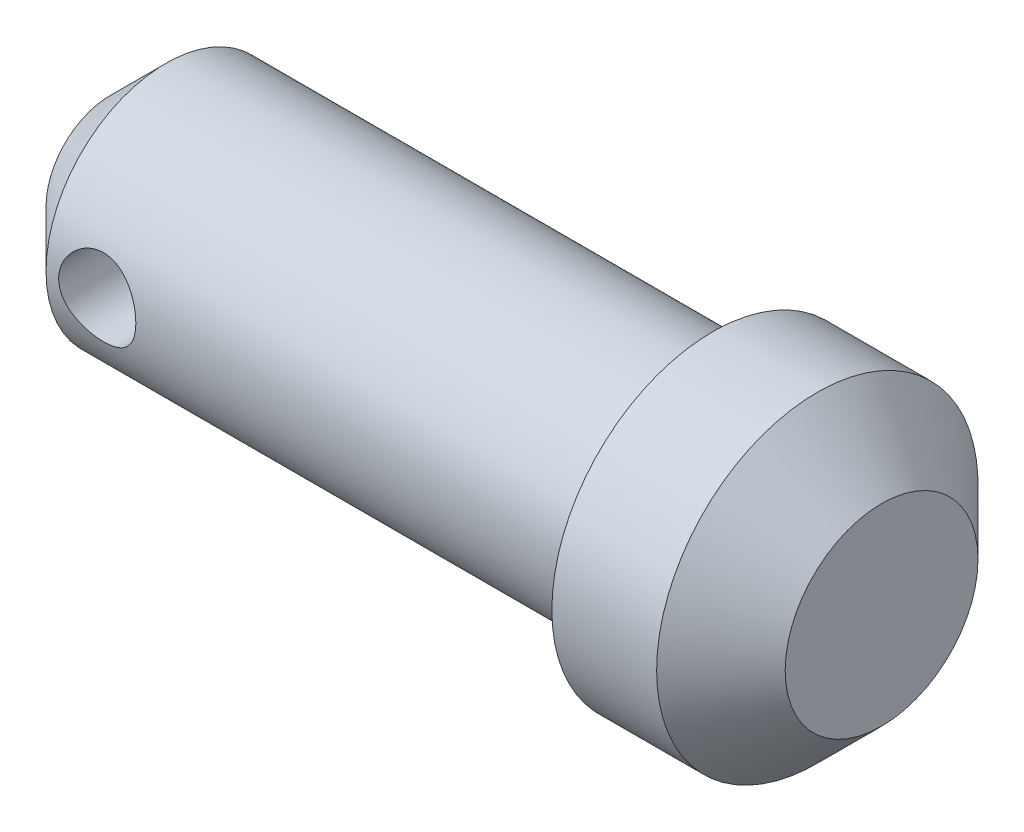
ISO-10303-21;
HEADER;
FILE_DESCRIPTION(('STEP AP214'),'2;1');
FILE_NAME('part.step','',(''),(''),'','','');
FILE_SCHEMA(('AUTOMOTIVE_DESIGN { 1 0 10303 214 1 1 1 1 }'));
ENDSEC;
DATA;
#1=APPLICATION_CONTEXT('core data for automotive mechanical design processes');
#2=APPLICATION_PROTOCOL_DEFINITION('international standard','automotive_design',2000,#1);
#3=PRODUCT_CONTEXT('',#1,'mechanical');
#4=PRODUCT('Part','Part','',(#3));
#5=PRODUCT_RELATED_PRODUCT_CATEGORY('part','',(#4));
#6=PRODUCT_DEFINITION_FORMATION('','',#4);
#7=PRODUCT_DEFINITION_CONTEXT('part definition',#1,'design');
#8=PRODUCT_DEFINITION('design','',#6,#7);
#9=PRODUCT_DEFINITION_SHAPE('','',#8);
#10=(LENGTH_UNIT() NAMED_UNIT(*) SI_UNIT(.MILLI.,.METRE.));
#11=(NAMED_UNIT(*) PLANE_ANGLE_UNIT() SI_UNIT($,.RADIAN.));
#12=(NAMED_UNIT(*) SI_UNIT($,.STERADIAN.) SOLID_ANGLE_UNIT());
#13=UNCERTAINTY_MEASURE_WITH_UNIT(LENGTH_MEASURE(1.E-05),#10,'distance_accuracy_value','');
#14=(GEOMETRIC_REPRESENTATION_CONTEXT(3) GLOBAL_UNCERTAINTY_ASSIGNED_CONTEXT((#13)) GLOBAL_UNIT_ASSIGNED_CONTEXT((#10,
#11,#12)) REPRESENTATION_CONTEXT('',''));
#15=CARTESIAN_POINT('',(0.,0.,0.));
#16=DIRECTION('',(0.,0.,1.));
#17=DIRECTION('',(1.,0.,0.));
#18=AXIS2_PLACEMENT_3D('',#15,#16,#17);
#19=CARTESIAN_POINT('',(0.,0.,0.));
#20=DIRECTION('',(-1.,0.,0.));
#21=DIRECTION('',(0.,0.,1.));
#22=AXIS2_PLACEMENT_3D('',#19,#20,#21);
#23=PLANE('',#22);
#24=CARTESIAN_POINT('',(0.,0.,0.));
#25=DIRECTION('',(-1.,0.,0.));
#26=DIRECTION('',(0.,0.,1.));
#27=AXIS2_PLACEMENT_3D('',#24,#25,#26);
#28=CIRCLE('',#27,10.);
#29=CARTESIAN_POINT('',(0.,0.,10.));
#30=VERTEX_POINT('',#29);
#31=EDGE_CURVE('E10',#30,#30,#28,.T.);
#32=ORIENTED_EDGE('',*,*,#31,.T.);
#33=EDGE_LOOP('',(#32));
#34=FACE_BOUND('',#33,.T.);
#35=ADVANCED_FACE('F37',(#34),#23,.T.);
#36=CARTESIAN_POINT('',(0.,0.,0.));
#37=DIRECTION('',(1.,0.,0.));
#38=DIRECTION('',(0.,0.,-1.));
#39=AXIS2_PLACEMENT_3D('',#36,#37,#38);
#40=CONICAL_SURFACE('',#39,10.,0.785398163397449);
#41=CARTESIAN_POINT('',(8.69999999999859,0.,0.));
#42=DIRECTION('',(-1.,0.,0.));
#43=DIRECTION('',(0.,0.,1.));
#44=AXIS2_PLACEMENT_3D('',#41,#42,#43);
#45=CIRCLE('',#44,18.6999999999986);
#46=CARTESIAN_POINT('',(8.69999999999859,0.,18.6999999999986));
#47=VERTEX_POINT('',#46);
#48=EDGE_CURVE('E50',#47,#47,#45,.T.);
#49=ORIENTED_EDGE('',*,*,#48,.T.);
#50=EDGE_LOOP('',(#49));
#51=FACE_BOUND('',#50,.T.);
#52=ORIENTED_EDGE('',*,*,#31,.F.);
#53=EDGE_LOOP('',(#52));
#54=FACE_BOUND('',#53,.T.);
#55=ADVANCED_FACE('F91',(#51,#54),#40,.T.);
#56=CARTESIAN_POINT('',(0.,0.,0.));
#57=DIRECTION('',(-1.,0.,0.));
#58=DIRECTION('',(0.,0.,1.));
#59=AXIS2_PLACEMENT_3D('',#56,#57,#58);
#60=CYLINDRICAL_SURFACE('',#59,18.6999999999986);
#61=CARTESIAN_POINT('',(22.6693615722956,0.,18.6999999999986));
#62=CARTESIAN_POINT('',(22.6693735509664,0.328109534118284,18.7000048554288));
#63=CARTESIAN_POINT('',(22.6423724883779,0.656146611009068,18.6912882232569));
#64=CARTESIAN_POINT('',(22.5354008768268,1.3026514538392,18.6573812329447));
#65=CARTESIAN_POINT('',(22.4554209237638,1.62111751036627,18.6321879501011));
#66=CARTESIAN_POINT('',(22.245508831408,2.238968089823,18.5680773563979));
#67=CARTESIAN_POINT('',(22.1156564700291,2.53838220188377,18.5291819721548));
#68=CARTESIAN_POINT('',(21.8098989363146,3.11130651797304,18.4416310751336));
#69=CARTESIAN_POINT('',(21.6339857638815,3.38481221083469,18.3929738672114));
#70=CARTESIAN_POINT('',(21.3365508082946,3.77428013280126,18.3156533449803));
#71=CARTESIAN_POINT('',(21.2300157778527,3.90232724347732,18.2887354355524));
#72=CARTESIAN_POINT('',(21.0067535096186,4.14905616968068,18.2343425448417));
#73=CARTESIAN_POINT('',(20.890029677546,4.26774108956259,18.2068677520432));
#74=CARTESIAN_POINT('',(20.6470455986028,4.4950793667383,18.1520785703311));
#75=CARTESIAN_POINT('',(20.5207801226247,4.6037271498269,18.1247642783437));
#76=CARTESIAN_POINT('',(20.2595791511604,4.81020145237185,18.0710634960799));
#77=CARTESIAN_POINT('',(20.1246468381258,4.90803190842979,18.0446766706836));
#78=CARTESIAN_POINT('',(19.8431698302541,5.09472465659219,17.9928713578608));
#79=CARTESIAN_POINT('',(19.6964110211033,5.18327693138028,17.9674976741915));
#80=CARTESIAN_POINT('',(19.3955908380135,5.34761970843705,17.9192716978587));
#81=CARTESIAN_POINT('',(19.2415323710221,5.42341523699652,17.8964184133608));
#82=CARTESIAN_POINT('',(18.9270749427392,5.56167551879581,17.8539351665503));
#83=CARTESIAN_POINT('',(18.7666747565416,5.62413768163344,17.8343058307558));
#84=CARTESIAN_POINT('',(18.4407818920026,5.73512730708185,17.7989244314423));
#85=CARTESIAN_POINT('',(18.2752915348944,5.783661020055,17.7831706292405));
#86=CARTESIAN_POINT('',(17.945622610596,5.8650729815511,17.7564832509881));
#87=CARTESIAN_POINT('',(17.7815637245673,5.89839175445874,17.7454148263501));
#88=CARTESIAN_POINT('',(17.4510626526247,5.95121290359013,17.7277703908305));
#89=CARTESIAN_POINT('',(17.2846214764323,5.97072096626196,17.721192531035));
#90=CARTESIAN_POINT('',(16.9505791194139,5.99574585479344,17.7127413716562));
#91=CARTESIAN_POINT('',(16.7829779950792,6.00126335727513,17.7108678445584));
#92=CARTESIAN_POINT('',(16.4479188395278,5.99825219490308,17.7118879279125));
#93=CARTESIAN_POINT('',(16.2804608047629,5.98972388909304,17.7147814165083));
#94=CARTESIAN_POINT('',(15.9540315823558,5.95936494721762,17.7250165074377));
#95=CARTESIAN_POINT('',(15.7950003386963,5.9381105413663,17.7321653521666));
#96=CARTESIAN_POINT('',(15.4793243491549,5.88298327496223,17.7505310080279));
#97=CARTESIAN_POINT('',(15.3226804278704,5.84910615284747,17.7617491929787));
#98=CARTESIAN_POINT('',(15.0129417562595,5.76904277985811,17.7879148754638));
#99=CARTESIAN_POINT('',(14.8598460055259,5.72286004559839,17.802861307487));
#100=CARTESIAN_POINT('',(14.5580901670587,5.61854328577134,17.836058015027));
#101=CARTESIAN_POINT('',(14.4094317846026,5.56040473161652,17.8543095421234));
#102=CARTESIAN_POINT('',(14.1153598784949,5.43168648371439,17.8938922534336));
#103=CARTESIAN_POINT('',(13.9700271533132,5.36093509810377,17.915265089266));
#104=CARTESIAN_POINT('',(13.6857639149534,5.20808959767419,17.9602936796372));
#105=CARTESIAN_POINT('',(13.5468356140104,5.12599160205067,17.9839502144158));
#106=CARTESIAN_POINT('',(13.2762329184513,4.95102407600004,18.0329035493091));
#107=CARTESIAN_POINT('',(13.1445589206831,4.85815395714362,18.0582004389952));
#108=CARTESIAN_POINT('',(12.8892183851991,4.66223292016633,18.1097720464532));
#109=CARTESIAN_POINT('',(12.7655521091061,4.55918166969211,18.136046796129));
#110=CARTESIAN_POINT('',(12.5211555446983,4.33829588642842,18.1901823170992));
#111=CARTESIAN_POINT('',(12.4008565378056,4.21998741312795,18.2180583347834));
#112=CARTESIAN_POINT('',(12.1706368916388,3.97364933279474,18.2733696570101));
#113=CARTESIAN_POINT('',(12.0607129625427,3.84562283063084,18.3008050989487));
#114=CARTESIAN_POINT('',(11.8518786656944,3.58055011655919,18.3545076860038));
#115=CARTESIAN_POINT('',(11.7529734085658,3.44349976575655,18.3807742856299));
#116=CARTESIAN_POINT('',(11.566969780671,3.1613505891794,18.431396959695));
#117=CARTESIAN_POINT('',(11.479866754211,3.01625496908593,18.4557537858865));
#118=CARTESIAN_POINT('',(11.317346237551,2.7175540629313,18.5021064843882));
#119=CARTESIAN_POINT('',(11.2420417290649,2.56388360654837,18.5240789753946));
#120=CARTESIAN_POINT('',(11.1047296444641,2.25036568780717,18.5647738477796));
#121=CARTESIAN_POINT('',(11.0427168672853,2.09052067056216,18.5834974998829));
#122=CARTESIAN_POINT('',(10.9325063242742,1.76575587813771,18.6171628600495));
#123=CARTESIAN_POINT('',(10.8843077456836,1.60083640214647,18.6321047906044));
#124=CARTESIAN_POINT('',(10.8021799914685,1.26716115885481,18.6577676949712));
#125=CARTESIAN_POINT('',(10.7682502121137,1.09840555418413,18.6684888473681));
#126=CARTESIAN_POINT('',(10.7160800227462,0.765305154565457,18.6850468627906));
#127=CARTESIAN_POINT('',(10.6972572915472,0.601060358689682,18.691064747042));
#128=CARTESIAN_POINT('',(10.6732251958003,0.271416329988868,18.6987571892623));
#129=CARTESIAN_POINT('',(10.6680205226336,0.106016719003151,18.7004302504509));
#130=CARTESIAN_POINT('',(10.6712880319728,-0.224547322379835,18.6993819215603));
#131=CARTESIAN_POINT('',(10.6797531932285,-0.389711829927278,18.6966627874485));
#132=CARTESIAN_POINT('',(10.7102715514233,-0.718713427178651,18.6869083829553));
#133=CARTESIAN_POINT('',(10.7323297617664,-0.882550004515454,18.6798715201084));
#134=CARTESIAN_POINT('',(10.7890558589953,-1.20324802069183,18.661920957705));
#135=CARTESIAN_POINT('',(10.8233688235768,-1.36017856885655,18.6511165631168));
#136=CARTESIAN_POINT('',(10.9043862299088,-1.67056721241264,18.6258814385084));
#137=CARTESIAN_POINT('',(10.9510950743522,-1.82402405297531,18.6114494201473));
#138=CARTESIAN_POINT('',(11.0565007198262,-2.12636238014194,18.5793350168858));
#139=CARTESIAN_POINT('',(11.1151942900416,-2.27524508741222,18.5616535081038));
#140=CARTESIAN_POINT('',(11.2441459063846,-2.56760015912167,18.5234762600866));
#141=CARTESIAN_POINT('',(11.3144080962346,-2.71107056223199,18.5029795129091));
#142=CARTESIAN_POINT('',(11.4678694775938,-2.99519553483939,18.4591435302785));
#143=CARTESIAN_POINT('',(11.5513479753659,-3.13569025659637,18.4357460826112));
#144=CARTESIAN_POINT('',(11.7293179315259,-3.40919206498344,18.3871342419641));
#145=CARTESIAN_POINT('',(11.8238097911262,-3.54219887857011,18.3619197828041));
#146=CARTESIAN_POINT('',(12.0232206620307,-3.79999220148298,18.3103071764804));
#147=CARTESIAN_POINT('',(12.1281438291885,-3.92477540131672,18.2839085598632));
#148=CARTESIAN_POINT('',(12.3476963082257,-4.16529906081116,18.2306186203854));
#149=CARTESIAN_POINT('',(12.462322624453,-4.28104229031701,18.203727451585));
#150=CARTESIAN_POINT('',(12.7056771842277,-4.50754846720009,18.1489986633681));
#151=CARTESIAN_POINT('',(12.834796991751,-4.61789313948128,18.1211691711632));
#152=CARTESIAN_POINT('',(13.1020081539205,-4.82729663841623,18.0665136789369));
#153=CARTESIAN_POINT('',(13.2400963112562,-4.92635945286448,18.0396873266021));
#154=CARTESIAN_POINT('',(13.5244744273928,-5.11259069878339,17.9877949594023));
#155=CARTESIAN_POINT('',(13.6707677463607,-5.19975420634253,17.9627296753338));
#156=CARTESIAN_POINT('',(13.9704964842813,-5.36144657434192,17.9151331103811));
#157=CARTESIAN_POINT('',(14.1239289005396,-5.43598068654382,17.8926007775221));
#158=CARTESIAN_POINT('',(14.4365230657313,-5.57165869622423,17.8508164518812));
#159=CARTESIAN_POINT('',(14.5956676200228,-5.63283940269786,17.8315554749341));
#160=CARTESIAN_POINT('',(14.9189027764371,-5.74151138164682,17.7968621749878));
#161=CARTESIAN_POINT('',(15.0829913380578,-5.78900821853937,17.7814282960917));
#162=CARTESIAN_POINT('',(15.4149342830085,-5.8698883600862,17.7548929902745));
#163=CARTESIAN_POINT('',(15.5827881476034,-5.90327359643249,17.7437909703951));
#164=CARTESIAN_POINT('',(15.9209729416108,-5.95560131882196,17.7262962263835));
#165=CARTESIAN_POINT('',(16.0913037579908,-5.97454446181705,17.7199032880419));
#166=CARTESIAN_POINT('',(16.4248854961256,-5.99723506055895,17.7122360172627));
#167=CARTESIAN_POINT('',(16.5880849590833,-6.00166660324887,17.7107312804444));
#168=CARTESIAN_POINT('',(16.9143391143923,-5.99721676179377,17.7122386402008));
#169=CARTESIAN_POINT('',(17.0773937384889,-5.98833084206198,17.7152522756176));
#170=CARTESIAN_POINT('',(17.4020241247518,-5.95733010920259,17.725701216618));
#171=CARTESIAN_POINT('',(17.5636004902292,-5.93522096191529,17.7331346284239));
#172=CARTESIAN_POINT('',(17.8842381795106,-5.87797639128052,17.7521914698313));
#173=CARTESIAN_POINT('',(18.0432985359782,-5.84283607891416,17.7638164719838));
#174=CARTESIAN_POINT('',(18.3551005687539,-5.76054232297797,17.7906714350161));
#175=CARTESIAN_POINT('',(18.5079034191296,-5.71359946251839,17.8058379014656));
#176=CARTESIAN_POINT('',(18.8090127085453,-5.60779535409026,17.8394425632556));
#177=CARTESIAN_POINT('',(18.9573175196749,-5.54892984893895,17.857881926948));
#178=CARTESIAN_POINT('',(19.2484354741734,-5.41975377528737,17.8975089899815));
#179=CARTESIAN_POINT('',(19.3912497060574,-5.34944548994999,17.9186961408892));
#180=CARTESIAN_POINT('',(19.6706321478571,-5.19785058046816,17.963256782633));
#181=CARTESIAN_POINT('',(19.8071979599453,-5.1165597883177,17.9866311024881));
#182=CARTESIAN_POINT('',(20.0786722988687,-4.94002535193613,18.0359327628247));
#183=CARTESIAN_POINT('',(20.2132887221665,-4.84434938683073,18.0619252116352));
#184=CARTESIAN_POINT('',(20.4740747501807,-4.64235106043807,18.1148976816546));
#185=CARTESIAN_POINT('',(20.6002411809582,-4.53602473573147,18.1418780681268));
#186=CARTESIAN_POINT('',(20.9649385570244,-4.20195433710695,18.223223448193));
#187=CARTESIAN_POINT('',(21.189876329578,-3.95898282810353,18.2780322903854));
#188=CARTESIAN_POINT('',(21.4987162479157,-3.56464456251411,18.3576215597846));
#189=CARTESIAN_POINT('',(21.5983492211628,-3.42555342554392,18.3841453121101));
#190=CARTESIAN_POINT('',(21.7855197490987,-3.1391282419148,18.4352103944782));
#191=CARTESIAN_POINT('',(21.8730626433868,-2.99179787477571,18.4597525976725));
#192=CARTESIAN_POINT('',(22.0353622739844,-2.68987480456371,18.5061586667599));
#193=CARTESIAN_POINT('',(22.1101196775168,-2.53528248099983,18.5280226724003));
#194=CARTESIAN_POINT('',(22.2462402109228,-2.21989160425773,18.5684504674997));
#195=CARTESIAN_POINT('',(22.3076039655992,-2.05909334099351,18.5870144108962));
#196=CARTESIAN_POINT('',(22.4126239687353,-1.74373345175721,18.6191495900889));
#197=CARTESIAN_POINT('',(22.4572103812694,-1.58950792071379,18.632977071051));
#198=CARTESIAN_POINT('',(22.5339421120807,-1.27770157607177,18.656956017467));
#199=CARTESIAN_POINT('',(22.5660837697311,-1.12011978958868,18.6671064012457));
#200=CARTESIAN_POINT('',(22.6433188755913,-0.644104010052157,18.6915898606381));
#201=CARTESIAN_POINT('',(22.6693498160479,-0.322017109326415,18.6999952347253));
#202=CARTESIAN_POINT('',(22.6693615722956,0.,18.6999999999986));
#203=B_SPLINE_CURVE_WITH_KNOTS('',3,(#61,#62,#63,#64,#65,#66,#67,#68,#69,#70,#71,#72,#73,#74,
#75,#76,#77,#78,#79,#80,#81,#82,#83,#84,#85,#86,#87,#88,#89,#90,#91,#92,#93,#94,#95,#96,#97,#98,
#99,#100,#101,#102,#103,#104,#105,#106,#107,#108,#109,#110,#111,#112,#113,#114,#115,#116,#117,
#118,#119,#120,#121,#122,#123,#124,#125,#126,#127,#128,#129,#130,#131,#132,#133,#134,#135,#136,
#137,#138,#139,#140,#141,#142,#143,#144,#145,#146,#147,#148,#149,#150,#151,#152,#153,#154,#155,
#156,#157,#158,#159,#160,#161,#162,#163,#164,#165,#166,#167,#168,#169,#170,#171,#172,#173,#174,
#175,#176,#177,#178,#179,#180,#181,#182,#183,#184,#185,#186,#187,#188,#189,#190,#191,#192,#193,
#194,#195,#196,#197,#198,#199,#200,#201,#202),.UNSPECIFIED.,.T.,.F.,(4,2,2,2,2,2,2,2,2,2,2,2,2,
2,2,2,2,2,2,2,2,2,2,2,2,2,2,2,2,2,2,2,2,2,2,2,2,2,2,2,2,2,2,2,2,2,2,2,2,2,2,2,2,2,2,2,2,2,2,2,2,
2,2,2,2,2,2,2,2,2,4),(0.,0.983005763343034,1.96618606342749,2.94780013535518,3.92958481269156,
4.43531035245975,4.94086749050855,5.44670372688413,5.95235527111154,6.4715370928268,
6.99051387016065,7.50959138256172,8.02843559448904,8.53111986205094,9.03359703287031,
9.53604990204526,10.0384899275488,10.5197382952358,11.0011492848757,11.4824228474029,
11.9638790420874,12.452474158943,12.9412368021592,13.4300261567142,13.9188314726081,
14.4312780390876,14.9435615646747,15.4560817143466,15.9683990949599,16.4853565656101,
17.0021113796304,17.5188357841407,18.0355383232181,18.5312123402069,19.0270570929809,
19.5226472455314,20.018420291699,20.5008656508861,20.9834825919268,21.4659696015456,
21.9486298089263,22.443346028389,22.9380802758004,23.4330124222385,23.9277923217541,
24.4435185204823,24.9590618561144,25.4748178801644,25.9903589049572,26.5044603592543,
27.018352462989,27.532174198873,28.0459725602842,28.5351723875982,29.0245388617152,
29.5136958039386,30.0030364535314,30.4841990458773,30.9655337493473,31.4467725302142,
31.9281944632869,32.4291511005994,32.9302948611988,33.9318339880062,34.4507647304866,
34.9694655485423,35.4881392894436,36.0067888294656,36.4896235307943,36.9726001503313,
37.9373532021241),.UNSPECIFIED.);
#204=CARTESIAN_POINT('',(22.6693615722956,0.,18.6999999999986));
#205=VERTEX_POINT('',#204);
#206=EDGE_CURVE('E40',#205,#205,#203,.T.);
#207=ORIENTED_EDGE('',*,*,#206,.F.);
#208=EDGE_LOOP('',(#207));
#209=FACE_BOUND('',#208,.T.);
#210=CARTESIAN_POINT('',(22.6693615722956,0.,-18.6999999999986));
#211=CARTESIAN_POINT('',(22.6693735509664,-0.328109534118284,-18.7000048554288));
#212=CARTESIAN_POINT('',(22.6423724883779,-0.656146611009068,-18.6912882232569));
#213=CARTESIAN_POINT('',(22.5354008768268,-1.3026514538392,-18.6573812329447));
#214=CARTESIAN_POINT('',(22.4554209237638,-1.62111751036627,-18.6321879501011));
#215=CARTESIAN_POINT('',(22.245508831408,-2.238968089823,-18.5680773563979));
#216=CARTESIAN_POINT('',(22.1156564700291,-2.53838220188377,-18.5291819721548));
#217=CARTESIAN_POINT('',(21.8098989363146,-3.11130651797304,-18.4416310751336));
#218=CARTESIAN_POINT('',(21.6339857638815,-3.38481221083469,-18.3929738672114));
#219=CARTESIAN_POINT('',(21.3365508082946,-3.77428013280126,-18.3156533449803));
#220=CARTESIAN_POINT('',(21.2300157778527,-3.90232724347732,-18.2887354355524));
#221=CARTESIAN_POINT('',(21.0067535096186,-4.14905616968068,-18.2343425448417));
#222=CARTESIAN_POINT('',(20.890029677546,-4.26774108956259,-18.2068677520432));
#223=CARTESIAN_POINT('',(20.6470455986028,-4.4950793667383,-18.1520785703311));
#224=CARTESIAN_POINT('',(20.5207801226247,-4.6037271498269,-18.1247642783437));
#225=CARTESIAN_POINT('',(20.2595791511604,-4.81020145237185,-18.0710634960799));
#226=CARTESIAN_POINT('',(20.1246468381258,-4.90803190842979,-18.0446766706836));
#227=CARTESIAN_POINT('',(19.8431698302541,-5.09472465659219,-17.9928713578608));
#228=CARTESIAN_POINT('',(19.6964110211033,-5.18327693138028,-17.9674976741915));
#229=CARTESIAN_POINT('',(19.3955908380135,-5.34761970843705,-17.9192716978587));
#230=CARTESIAN_POINT('',(19.2415323710221,-5.42341523699652,-17.8964184133608));
#231=CARTESIAN_POINT('',(18.9270749427392,-5.56167551879581,-17.8539351665503));
#232=CARTESIAN_POINT('',(18.7666747565416,-5.62413768163344,-17.8343058307558));
#233=CARTESIAN_POINT('',(18.4407818920026,-5.73512730708185,-17.7989244314423));
#234=CARTESIAN_POINT('',(18.2752915348944,-5.783661020055,-17.7831706292405));
#235=CARTESIAN_POINT('',(17.945622610596,-5.8650729815511,-17.7564832509881));
#236=CARTESIAN_POINT('',(17.7815637245673,-5.89839175445874,-17.7454148263501));
#237=CARTESIAN_POINT('',(17.4510626526247,-5.95121290359013,-17.7277703908305));
#238=CARTESIAN_POINT('',(17.2846214764323,-5.97072096626196,-17.721192531035));
#239=CARTESIAN_POINT('',(16.9505791194139,-5.99574585479344,-17.7127413716562));
#240=CARTESIAN_POINT('',(16.7829779950792,-6.00126335727513,-17.7108678445584));
#241=CARTESIAN_POINT('',(16.4479188395278,-5.99825219490308,-17.7118879279125));
#242=CARTESIAN_POINT('',(16.2804608047629,-5.98972388909304,-17.7147814165083));
#243=CARTESIAN_POINT('',(15.9540315823558,-5.95936494721762,-17.7250165074377));
#244=CARTESIAN_POINT('',(15.7950003386963,-5.9381105413663,-17.7321653521666));
#245=CARTESIAN_POINT('',(15.4793243491549,-5.88298327496223,-17.7505310080279));
#246=CARTESIAN_POINT('',(15.3226804278704,-5.84910615284747,-17.7617491929787));
#247=CARTESIAN_POINT('',(15.0129417562595,-5.76904277985811,-17.7879148754638));
#248=CARTESIAN_POINT('',(14.8598460055259,-5.72286004559839,-17.802861307487));
#249=CARTESIAN_POINT('',(14.5580901670587,-5.61854328577134,-17.836058015027));
#250=CARTESIAN_POINT('',(14.4094317846026,-5.56040473161652,-17.8543095421234));
#251=CARTESIAN_POINT('',(14.1153598784949,-5.43168648371439,-17.8938922534336));
#252=CARTESIAN_POINT('',(13.9700271533132,-5.36093509810377,-17.915265089266));
#253=CARTESIAN_POINT('',(13.6857639149534,-5.20808959767419,-17.9602936796372));
#254=CARTESIAN_POINT('',(13.5468356140104,-5.12599160205067,-17.9839502144158));
#255=CARTESIAN_POINT('',(13.2762329184513,-4.95102407600004,-18.0329035493091));
#256=CARTESIAN_POINT('',(13.1445589206831,-4.85815395714362,-18.0582004389952));
#257=CARTESIAN_POINT('',(12.8892183851991,-4.66223292016633,-18.1097720464532));
#258=CARTESIAN_POINT('',(12.7655521091061,-4.55918166969211,-18.136046796129));
#259=CARTESIAN_POINT('',(12.5211555446983,-4.33829588642842,-18.1901823170992));
#260=CARTESIAN_POINT('',(12.4008565378056,-4.21998741312795,-18.2180583347834));
#261=CARTESIAN_POINT('',(12.1706368916388,-3.97364933279474,-18.2733696570101));
#262=CARTESIAN_POINT('',(12.0607129625427,-3.84562283063084,-18.3008050989487));
#263=CARTESIAN_POINT('',(11.8518786656944,-3.58055011655919,-18.3545076860038));
#264=CARTESIAN_POINT('',(11.7529734085658,-3.44349976575655,-18.3807742856299));
#265=CARTESIAN_POINT('',(11.566969780671,-3.1613505891794,-18.431396959695));
#266=CARTESIAN_POINT('',(11.479866754211,-3.01625496908593,-18.4557537858865));
#267=CARTESIAN_POINT('',(11.317346237551,-2.7175540629313,-18.5021064843882));
#268=CARTESIAN_POINT('',(11.2420417290649,-2.56388360654837,-18.5240789753946));
#269=CARTESIAN_POINT('',(11.1047296444641,-2.25036568780717,-18.5647738477796));
#270=CARTESIAN_POINT('',(11.0427168672853,-2.09052067056216,-18.5834974998829));
#271=CARTESIAN_POINT('',(10.9325063242742,-1.76575587813771,-18.6171628600495));
#272=CARTESIAN_POINT('',(10.8843077456836,-1.60083640214647,-18.6321047906044));
#273=CARTESIAN_POINT('',(10.8021799914685,-1.26716115885481,-18.6577676949712));
#274=CARTESIAN_POINT('',(10.7682502121137,-1.09840555418413,-18.6684888473681));
#275=CARTESIAN_POINT('',(10.7160800227462,-0.765305154565457,-18.6850468627906));
#276=CARTESIAN_POINT('',(10.6972572915472,-0.601060358689682,-18.691064747042));
#277=CARTESIAN_POINT('',(10.6732251958003,-0.271416329988868,-18.6987571892623));
#278=CARTESIAN_POINT('',(10.6680205226336,-0.106016719003151,-18.7004302504509));
#279=CARTESIAN_POINT('',(10.6712880319728,0.224547322379835,-18.6993819215603));
#280=CARTESIAN_POINT('',(10.6797531932285,0.389711829927278,-18.6966627874485));
#281=CARTESIAN_POINT('',(10.7102715514233,0.718713427178651,-18.6869083829553));
#282=CARTESIAN_POINT('',(10.7323297617664,0.882550004515454,-18.6798715201084));
#283=CARTESIAN_POINT('',(10.7890558589953,1.20324802069183,-18.661920957705));
#284=CARTESIAN_POINT('',(10.8233688235768,1.36017856885655,-18.6511165631168));
#285=CARTESIAN_POINT('',(10.9043862299088,1.67056721241264,-18.6258814385084));
#286=CARTESIAN_POINT('',(10.9510950743522,1.82402405297531,-18.6114494201473));
#287=CARTESIAN_POINT('',(11.0565007198262,2.12636238014194,-18.5793350168858));
#288=CARTESIAN_POINT('',(11.1151942900416,2.27524508741222,-18.5616535081038));
#289=CARTESIAN_POINT('',(11.2441459063846,2.56760015912167,-18.5234762600866));
#290=CARTESIAN_POINT('',(11.3144080962346,2.71107056223199,-18.5029795129091));
#291=CARTESIAN_POINT('',(11.4678694775938,2.99519553483939,-18.4591435302785));
#292=CARTESIAN_POINT('',(11.5513479753659,3.13569025659637,-18.4357460826112));
#293=CARTESIAN_POINT('',(11.7293179315259,3.40919206498344,-18.3871342419641));
#294=CARTESIAN_POINT('',(11.8238097911262,3.54219887857011,-18.3619197828041));
#295=CARTESIAN_POINT('',(12.0232206620307,3.79999220148298,-18.3103071764804));
#296=CARTESIAN_POINT('',(12.1281438291885,3.92477540131672,-18.2839085598632));
#297=CARTESIAN_POINT('',(12.3476963082257,4.16529906081116,-18.2306186203854));
#298=CARTESIAN_POINT('',(12.462322624453,4.28104229031701,-18.203727451585));
#299=CARTESIAN_POINT('',(12.7056771842277,4.50754846720009,-18.1489986633681));
#300=CARTESIAN_POINT('',(12.834796991751,4.61789313948128,-18.1211691711632));
#301=CARTESIAN_POINT('',(13.1020081539205,4.82729663841623,-18.0665136789369));
#302=CARTESIAN_POINT('',(13.2400963112562,4.92635945286448,-18.0396873266021));
#303=CARTESIAN_POINT('',(13.5244744273928,5.11259069878339,-17.9877949594023));
#304=CARTESIAN_POINT('',(13.6707677463607,5.19975420634253,-17.9627296753338));
#305=CARTESIAN_POINT('',(13.9704964842813,5.36144657434192,-17.9151331103811));
#306=CARTESIAN_POINT('',(14.1239289005396,5.43598068654382,-17.8926007775221));
#307=CARTESIAN_POINT('',(14.4365230657313,5.57165869622423,-17.8508164518812));
#308=CARTESIAN_POINT('',(14.5956676200228,5.63283940269786,-17.8315554749341));
#309=CARTESIAN_POINT('',(14.9189027764371,5.74151138164682,-17.7968621749878));
#310=CARTESIAN_POINT('',(15.0829913380578,5.78900821853937,-17.7814282960917));
#311=CARTESIAN_POINT('',(15.4149342830085,5.8698883600862,-17.7548929902745));
#312=CARTESIAN_POINT('',(15.5827881476034,5.90327359643249,-17.7437909703951));
#313=CARTESIAN_POINT('',(15.9209729416108,5.95560131882196,-17.7262962263835));
#314=CARTESIAN_POINT('',(16.0913037579908,5.97454446181705,-17.7199032880419));
#315=CARTESIAN_POINT('',(16.4248854961256,5.99723506055895,-17.7122360172627));
#316=CARTESIAN_POINT('',(16.5880849590833,6.00166660324887,-17.7107312804444));
#317=CARTESIAN_POINT('',(16.9143391143923,5.99721676179377,-17.7122386402008));
#318=CARTESIAN_POINT('',(17.0773937384889,5.98833084206198,-17.7152522756176));
#319=CARTESIAN_POINT('',(17.4020241247518,5.95733010920259,-17.725701216618));
#320=CARTESIAN_POINT('',(17.5636004902292,5.93522096191529,-17.7331346284239));
#321=CARTESIAN_POINT('',(17.8842381795106,5.87797639128052,-17.7521914698313));
#322=CARTESIAN_POINT('',(18.0432985359782,5.84283607891416,-17.7638164719838));
#323=CARTESIAN_POINT('',(18.3551005687539,5.76054232297797,-17.7906714350161));
#324=CARTESIAN_POINT('',(18.5079034191296,5.71359946251839,-17.8058379014656));
#325=CARTESIAN_POINT('',(18.8090127085453,5.60779535409026,-17.8394425632556));
#326=CARTESIAN_POINT('',(18.9573175196749,5.54892984893895,-17.857881926948));
#327=CARTESIAN_POINT('',(19.2484354741734,5.41975377528737,-17.8975089899815));
#328=CARTESIAN_POINT('',(19.3912497060574,5.34944548994999,-17.9186961408892));
#329=CARTESIAN_POINT('',(19.6706321478571,5.19785058046816,-17.963256782633));
#330=CARTESIAN_POINT('',(19.8071979599453,5.1165597883177,-17.9866311024881));
#331=CARTESIAN_POINT('',(20.0786722988687,4.94002535193613,-18.0359327628247));
#332=CARTESIAN_POINT('',(20.2132887221665,4.84434938683073,-18.0619252116352));
#333=CARTESIAN_POINT('',(20.4740747501807,4.64235106043807,-18.1148976816546));
#334=CARTESIAN_POINT('',(20.6002411809582,4.53602473573147,-18.1418780681268));
#335=CARTESIAN_POINT('',(20.9649385570244,4.20195433710695,-18.223223448193));
#336=CARTESIAN_POINT('',(21.189876329578,3.95898282810353,-18.2780322903854));
#337=CARTESIAN_POINT('',(21.4987162479157,3.56464456251411,-18.3576215597846));
#338=CARTESIAN_POINT('',(21.5983492211628,3.42555342554392,-18.3841453121101));
#339=CARTESIAN_POINT('',(21.7855197490987,3.1391282419148,-18.4352103944782));
#340=CARTESIAN_POINT('',(21.8730626433868,2.99179787477571,-18.4597525976725));
#341=CARTESIAN_POINT('',(22.0353622739844,2.68987480456371,-18.5061586667599));
#342=CARTESIAN_POINT('',(22.1101196775168,2.53528248099983,-18.5280226724003));
#343=CARTESIAN_POINT('',(22.2462402109228,2.21989160425773,-18.5684504674997));
#344=CARTESIAN_POINT('',(22.3076039655992,2.05909334099351,-18.5870144108962));
#345=CARTESIAN_POINT('',(22.4126239687353,1.74373345175721,-18.6191495900889));
#346=CARTESIAN_POINT('',(22.4572103812694,1.58950792071379,-18.632977071051));
#347=CARTESIAN_POINT('',(22.5339421120807,1.27770157607177,-18.656956017467));
#348=CARTESIAN_POINT('',(22.5660837697311,1.12011978958868,-18.6671064012457));
#349=CARTESIAN_POINT('',(22.6433188755913,0.644104010052157,-18.6915898606381));
#350=CARTESIAN_POINT('',(22.6693498160479,0.322017109326415,-18.6999952347253));
#351=CARTESIAN_POINT('',(22.6693615722956,0.,-18.6999999999986));
#352=B_SPLINE_CURVE_WITH_KNOTS('',3,(#210,#211,#212,#213,#214,#215,#216,#217,#218,#219,#220,
#221,#222,#223,#224,#225,#226,#227,#228,#229,#230,#231,#232,#233,#234,#235,#236,#237,#238,#239,
#240,#241,#242,#243,#244,#245,#246,#247,#248,#249,#250,#251,#252,#253,#254,#255,#256,#257,#258,
#259,#260,#261,#262,#263,#264,#265,#266,#267,#268,#269,#270,#271,#272,#273,#274,#275,#276,#277,
#278,#279,#280,#281,#282,#283,#284,#285,#286,#287,#288,#289,#290,#291,#292,#293,#294,#295,#296,
#297,#298,#299,#300,#301,#302,#303,#304,#305,#306,#307,#308,#309,#310,#311,#312,#313,#314,#315,
#316,#317,#318,#319,#320,#321,#322,#323,#324,#325,#326,#327,#328,#329,#330,#331,#332,#333,#334,
#335,#336,#337,#338,#339,#340,#341,#342,#343,#344,#345,#346,#347,#348,#349,#350,#351),
.UNSPECIFIED.,.T.,.F.,(4,2,2,2,2,2,2,2,2,2,2,2,2,2,2,2,2,2,2,2,2,2,2,2,2,2,2,2,2,2,2,2,2,2,2,2,
2,2,2,2,2,2,2,2,2,2,2,2,2,2,2,2,2,2,2,2,2,2,2,2,2,2,2,2,2,2,2,2,2,2,4),(0.,0.983005763343034,
1.96618606342749,2.94780013535518,3.92958481269156,4.43531035245975,4.94086749050855,
5.44670372688413,5.95235527111154,6.4715370928268,6.99051387016065,7.50959138256172,
8.02843559448904,8.53111986205094,9.03359703287031,9.53604990204526,10.0384899275488,
10.5197382952358,11.0011492848757,11.4824228474029,11.9638790420874,12.452474158943,
12.9412368021592,13.4300261567142,13.9188314726081,14.4312780390876,14.9435615646747,
15.4560817143466,15.9683990949599,16.4853565656101,17.0021113796304,17.5188357841407,
18.0355383232181,18.5312123402069,19.0270570929809,19.5226472455314,20.018420291699,
20.5008656508861,20.9834825919268,21.4659696015456,21.9486298089263,22.443346028389,
22.9380802758004,23.4330124222385,23.9277923217541,24.4435185204823,24.9590618561144,
25.4748178801644,25.9903589049572,26.5044603592543,27.018352462989,27.532174198873,
28.0459725602842,28.5351723875982,29.0245388617152,29.5136958039386,30.0030364535314,
30.4841990458773,30.9655337493473,31.4467725302142,31.9281944632869,32.4291511005994,
32.9302948611988,33.9318339880062,34.4507647304866,34.9694655485423,35.4881392894436,
36.0067888294656,36.4896235307943,36.9726001503313,37.9373532021241),.UNSPECIFIED.);
#353=CARTESIAN_POINT('',(22.6693615722956,0.,-18.6999999999986));
#354=VERTEX_POINT('',#353);
#355=EDGE_CURVE('E59',#354,#354,#352,.T.);
#356=ORIENTED_EDGE('',*,*,#355,.F.);
#357=EDGE_LOOP('',(#356));
#358=FACE_BOUND('',#357,.T.);
#359=CARTESIAN_POINT('',(93.6999999999986,0.,0.));
#360=DIRECTION('',(-1.,0.,0.));
#361=DIRECTION('',(0.,0.,1.));
#362=AXIS2_PLACEMENT_3D('',#359,#360,#361);
#363=CIRCLE('',#362,18.6999999999986);
#364=CARTESIAN_POINT('',(93.6999999999986,0.,18.6999999999986));
#365=VERTEX_POINT('',#364);
#366=EDGE_CURVE('E56',#365,#365,#363,.T.);
#367=ORIENTED_EDGE('',*,*,#366,.T.);
#368=EDGE_LOOP('',(#367));
#369=FACE_BOUND('',#368,.T.);
#370=ORIENTED_EDGE('',*,*,#48,.F.);
#371=EDGE_LOOP('',(#370));
#372=FACE_BOUND('',#371,.T.);
#373=ADVANCED_FACE('F65',(#209,#358,#369,#372),#60,.T.);
#374=CARTESIAN_POINT('',(93.6999999999986,-25.,0.));
#375=DIRECTION('',(-1.,0.,0.));
#376=DIRECTION('',(0.,0.,1.));
#377=AXIS2_PLACEMENT_3D('',#374,#375,#376);
#378=PLANE('',#377);
#379=CARTESIAN_POINT('',(93.6999999999986,0.,0.));
#380=DIRECTION('',(-1.,0.,0.));
#381=DIRECTION('',(0.,0.,1.));
#382=AXIS2_PLACEMENT_3D('',#379,#380,#381);
#383=CIRCLE('',#382,25.);
#384=CARTESIAN_POINT('',(93.6999999999986,0.,25.));
#385=VERTEX_POINT('',#384);
#386=EDGE_CURVE('E148',#385,#385,#383,.T.);
#387=ORIENTED_EDGE('',*,*,#386,.T.);
#388=EDGE_LOOP('',(#387));
#389=FACE_BOUND('',#388,.T.);
#390=ORIENTED_EDGE('',*,*,#366,.F.);
#391=EDGE_LOOP('',(#390));
#392=FACE_BOUND('',#391,.T.);
#393=ADVANCED_FACE('F84',(#389,#392),#378,.T.);
#394=CARTESIAN_POINT('',(0.,0.,0.));
#395=DIRECTION('',(-1.,0.,0.));
#396=DIRECTION('',(0.,0.,1.));
#397=AXIS2_PLACEMENT_3D('',#394,#395,#396);
#398=CYLINDRICAL_SURFACE('',#397,25.);
#399=CARTESIAN_POINT('',(110.,0.,0.));
#400=DIRECTION('',(-1.,0.,0.));
#401=DIRECTION('',(0.,0.,1.));
#402=AXIS2_PLACEMENT_3D('',#399,#400,#401);
#403=CIRCLE('',#402,25.);
#404=CARTESIAN_POINT('',(110.,0.,25.));
#405=VERTEX_POINT('',#404);
#406=EDGE_CURVE('E154',#405,#405,#403,.T.);
#407=ORIENTED_EDGE('',*,*,#406,.T.);
#408=EDGE_LOOP('',(#407));
#409=FACE_BOUND('',#408,.T.);
#410=ORIENTED_EDGE('',*,*,#386,.F.);
#411=EDGE_LOOP('',(#410));
#412=FACE_BOUND('',#411,.T.);
#413=ADVANCED_FACE('F81',(#409,#412),#398,.T.);
#414=CARTESIAN_POINT('',(110.,0.,0.));
#415=DIRECTION('',(-1.,0.,0.));
#416=DIRECTION('',(0.,0.,1.));
#417=AXIS2_PLACEMENT_3D('',#414,#415,#416);
#418=CONICAL_SURFACE('',#417,25.,0.785398163397451);
#419=CARTESIAN_POINT('',(120.,0.,0.));
#420=DIRECTION('',(-1.,0.,0.));
#421=DIRECTION('',(0.,0.,1.));
#422=AXIS2_PLACEMENT_3D('',#419,#420,#421);
#423=CIRCLE('',#422,15.);
#424=CARTESIAN_POINT('',(120.,0.,15.));
#425=VERTEX_POINT('',#424);
#426=EDGE_CURVE('E160',#425,#425,#423,.T.);
#427=ORIENTED_EDGE('',*,*,#426,.T.);
#428=EDGE_LOOP('',(#427));
#429=FACE_BOUND('',#428,.T.);
#430=ORIENTED_EDGE('',*,*,#406,.F.);
#431=EDGE_LOOP('',(#430));
#432=FACE_BOUND('',#431,.T.);
#433=ADVANCED_FACE('F77',(#429,#432),#418,.T.);
#434=CARTESIAN_POINT('',(120.,0.,0.));
#435=DIRECTION('',(1.,0.,0.));
#436=DIRECTION('',(0.,0.,-1.));
#437=AXIS2_PLACEMENT_3D('',#434,#435,#436);
#438=PLANE('',#437);
#439=ORIENTED_EDGE('',*,*,#426,.F.);
#440=EDGE_LOOP('',(#439));
#441=FACE_BOUND('',#440,.T.);
#442=ADVANCED_FACE('F72',(#441),#438,.T.);
#443=CARTESIAN_POINT('',(16.6693615722956,0.,-25.));
#444=DIRECTION('',(0.,0.,1.));
#445=DIRECTION('',(1.,0.,0.));
#446=AXIS2_PLACEMENT_3D('',#443,#444,#445);
#447=CYLINDRICAL_SURFACE('',#446,6.);
#448=ORIENTED_EDGE('',*,*,#206,.T.);
#449=EDGE_LOOP('',(#448));
#450=FACE_BOUND('',#449,.T.);
#451=ORIENTED_EDGE('',*,*,#355,.T.);
#452=EDGE_LOOP('',(#451));
#453=FACE_BOUND('',#452,.T.);
#454=ADVANCED_FACE('F68',(#450,#453),#447,.F.);
#455=CLOSED_SHELL('',(#35,#55,#373,#393,#413,#433,#442,#454));
#456=MANIFOLD_SOLID_BREP('B2',#455);
#457=ADVANCED_BREP_SHAPE_REPRESENTATION('',(#18,#456),#14);
#458=SHAPE_DEFINITION_REPRESENTATION(#9,#457);
ENDSEC;
END-ISO-10303-21;
